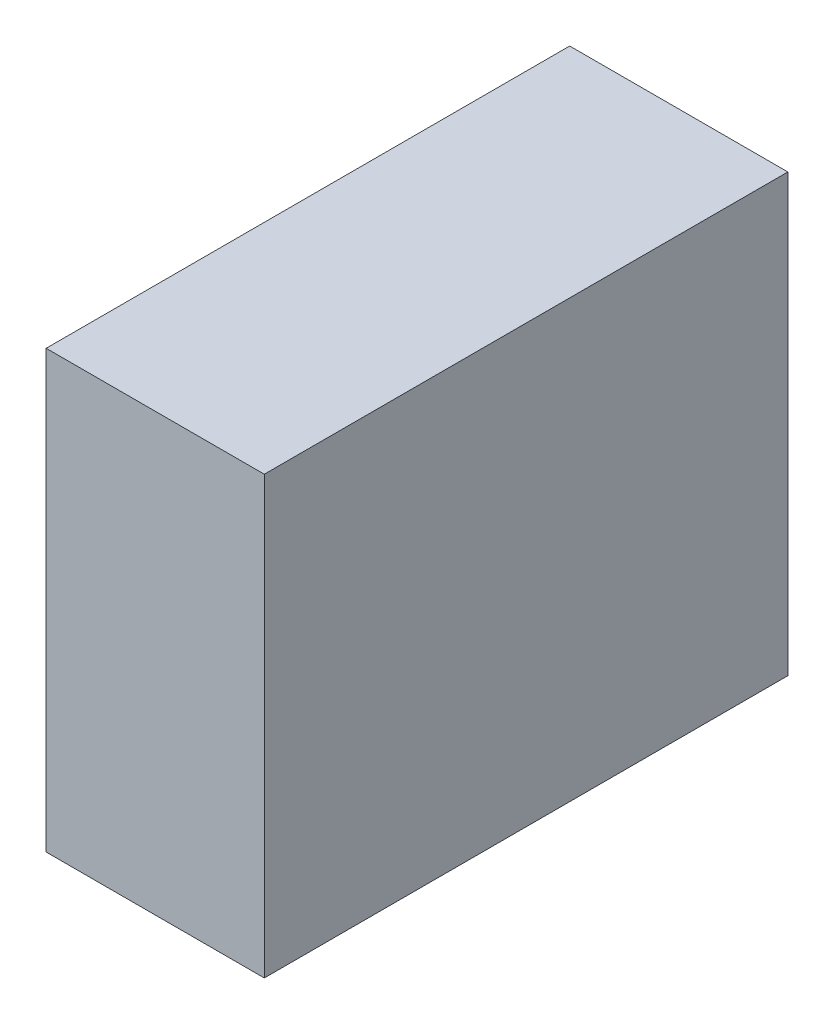
ISO-10303-21;
HEADER;
FILE_DESCRIPTION(('STEP AP214'),'2;1');
FILE_NAME('part.step','',(''),(''),'','','');
FILE_SCHEMA(('AUTOMOTIVE_DESIGN { 1 0 10303 214 1 1 1 1 }'));
ENDSEC;
DATA;
#1=APPLICATION_CONTEXT('core data for automotive mechanical design processes');
#2=APPLICATION_PROTOCOL_DEFINITION('international standard','automotive_design',2000,#1);
#3=PRODUCT_CONTEXT('',#1,'mechanical');
#4=PRODUCT('Part','Part','',(#3));
#5=PRODUCT_RELATED_PRODUCT_CATEGORY('part','',(#4));
#6=PRODUCT_DEFINITION_FORMATION('','',#4);
#7=PRODUCT_DEFINITION_CONTEXT('part definition',#1,'design');
#8=PRODUCT_DEFINITION('design','',#6,#7);
#9=PRODUCT_DEFINITION_SHAPE('','',#8);
#10=(LENGTH_UNIT() NAMED_UNIT(*) SI_UNIT(.MILLI.,.METRE.));
#11=(NAMED_UNIT(*) PLANE_ANGLE_UNIT() SI_UNIT($,.RADIAN.));
#12=(NAMED_UNIT(*) SI_UNIT($,.STERADIAN.) SOLID_ANGLE_UNIT());
#13=UNCERTAINTY_MEASURE_WITH_UNIT(LENGTH_MEASURE(1.E-05),#10,'distance_accuracy_value','');
#14=(GEOMETRIC_REPRESENTATION_CONTEXT(3) GLOBAL_UNCERTAINTY_ASSIGNED_CONTEXT((#13)) GLOBAL_UNIT_ASSIGNED_CONTEXT((#10,
#11,#12)) REPRESENTATION_CONTEXT('',''));
#15=CARTESIAN_POINT('',(0.,0.,0.));
#16=DIRECTION('',(0.,0.,1.));
#17=DIRECTION('',(1.,0.,0.));
#18=AXIS2_PLACEMENT_3D('',#15,#16,#17);
#19=CARTESIAN_POINT('',(440.,200.,-248.));
#20=DIRECTION('',(-1.,0.,0.));
#21=DIRECTION('',(0.,0.,1.));
#22=AXIS2_PLACEMENT_3D('',#19,#20,#21);
#23=PLANE('',#22);
#24=DIRECTION('',(0.,-1.,0.));
#25=VECTOR('',#24,1.);
#26=CARTESIAN_POINT('',(440.,200.,-128.));
#27=LINE('',#26,#25);
#28=CARTESIAN_POINT('',(440.,300.,-128.));
#29=VERTEX_POINT('',#28);
#30=CARTESIAN_POINT('',(440.,200.,-128.));
#31=VERTEX_POINT('',#30);
#32=EDGE_CURVE('E103',#29,#31,#27,.T.);
#33=ORIENTED_EDGE('',*,*,#32,.F.);
#34=DIRECTION('',(0.,0.,1.));
#35=VECTOR('',#34,1.);
#36=CARTESIAN_POINT('',(440.,300.,-248.));
#37=LINE('',#36,#35);
#38=CARTESIAN_POINT('',(440.,300.,-248.));
#39=VERTEX_POINT('',#38);
#40=EDGE_CURVE('E11',#39,#29,#37,.T.);
#41=ORIENTED_EDGE('',*,*,#40,.F.);
#42=DIRECTION('',(0.,-1.,0.));
#43=VECTOR('',#42,1.);
#44=CARTESIAN_POINT('',(440.,200.,-248.));
#45=LINE('',#44,#43);
#46=CARTESIAN_POINT('',(440.,200.,-248.));
#47=VERTEX_POINT('',#46);
#48=EDGE_CURVE('E97',#39,#47,#45,.T.);
#49=ORIENTED_EDGE('',*,*,#48,.T.);
#50=DIRECTION('',(0.,0.,1.));
#51=VECTOR('',#50,1.);
#52=CARTESIAN_POINT('',(440.,200.,-248.));
#53=LINE('',#52,#51);
#54=EDGE_CURVE('E42',#47,#31,#53,.T.);
#55=ORIENTED_EDGE('',*,*,#54,.T.);
#56=EDGE_LOOP('',(#33,#41,#49,#55));
#57=FACE_BOUND('',#56,.T.);
#58=ADVANCED_FACE('F39',(#57),#23,.T.);
#59=CARTESIAN_POINT('',(440.,300.,-248.));
#60=DIRECTION('',(0.,1.,0.));
#61=DIRECTION('',(0.,0.,1.));
#62=AXIS2_PLACEMENT_3D('',#59,#60,#61);
#63=PLANE('',#62);
#64=DIRECTION('',(-1.,0.,0.));
#65=VECTOR('',#64,1.);
#66=CARTESIAN_POINT('',(440.,300.,-128.));
#67=LINE('',#66,#65);
#68=CARTESIAN_POINT('',(490.,300.,-128.));
#69=VERTEX_POINT('',#68);
#70=EDGE_CURVE('E99',#69,#29,#67,.T.);
#71=ORIENTED_EDGE('',*,*,#70,.F.);
#72=DIRECTION('',(0.,0.,1.));
#73=VECTOR('',#72,1.);
#74=CARTESIAN_POINT('',(490.,300.,-248.));
#75=LINE('',#74,#73);
#76=CARTESIAN_POINT('',(490.,300.,-248.));
#77=VERTEX_POINT('',#76);
#78=EDGE_CURVE('E48',#77,#69,#75,.T.);
#79=ORIENTED_EDGE('',*,*,#78,.F.);
#80=DIRECTION('',(-1.,0.,0.));
#81=VECTOR('',#80,1.);
#82=CARTESIAN_POINT('',(440.,300.,-248.));
#83=LINE('',#82,#81);
#84=EDGE_CURVE('E94',#77,#39,#83,.T.);
#85=ORIENTED_EDGE('',*,*,#84,.T.);
#86=ORIENTED_EDGE('',*,*,#40,.T.);
#87=EDGE_LOOP('',(#71,#79,#85,#86));
#88=FACE_BOUND('',#87,.T.);
#89=ADVANCED_FACE('F113',(#88),#63,.T.);
#90=CARTESIAN_POINT('',(490.,200.,-248.));
#91=DIRECTION('',(1.,0.,0.));
#92=DIRECTION('',(0.,0.,-1.));
#93=AXIS2_PLACEMENT_3D('',#90,#91,#92);
#94=PLANE('',#93);
#95=DIRECTION('',(0.,1.,0.));
#96=VECTOR('',#95,1.);
#97=CARTESIAN_POINT('',(490.,200.,-128.));
#98=LINE('',#97,#96);
#99=CARTESIAN_POINT('',(490.,200.,-128.));
#100=VERTEX_POINT('',#99);
#101=EDGE_CURVE('E89',#100,#69,#98,.T.);
#102=ORIENTED_EDGE('',*,*,#101,.F.);
#103=DIRECTION('',(0.,0.,1.));
#104=VECTOR('',#103,1.);
#105=CARTESIAN_POINT('',(490.,200.,-248.));
#106=LINE('',#105,#104);
#107=CARTESIAN_POINT('',(490.,200.,-248.));
#108=VERTEX_POINT('',#107);
#109=EDGE_CURVE('E84',#108,#100,#106,.T.);
#110=ORIENTED_EDGE('',*,*,#109,.F.);
#111=DIRECTION('',(0.,1.,0.));
#112=VECTOR('',#111,1.);
#113=CARTESIAN_POINT('',(490.,200.,-248.));
#114=LINE('',#113,#112);
#115=EDGE_CURVE('E87',#108,#77,#114,.T.);
#116=ORIENTED_EDGE('',*,*,#115,.T.);
#117=ORIENTED_EDGE('',*,*,#78,.T.);
#118=EDGE_LOOP('',(#102,#110,#116,#117));
#119=FACE_BOUND('',#118,.T.);
#120=ADVANCED_FACE('F86',(#119),#94,.T.);
#121=CARTESIAN_POINT('',(440.,200.,-248.));
#122=DIRECTION('',(0.,-1.,0.));
#123=DIRECTION('',(0.,0.,-1.));
#124=AXIS2_PLACEMENT_3D('',#121,#122,#123);
#125=PLANE('',#124);
#126=DIRECTION('',(1.,0.,0.));
#127=VECTOR('',#126,1.);
#128=CARTESIAN_POINT('',(440.,200.,-128.));
#129=LINE('',#128,#127);
#130=EDGE_CURVE('E106',#31,#100,#129,.T.);
#131=ORIENTED_EDGE('',*,*,#130,.F.);
#132=ORIENTED_EDGE('',*,*,#54,.F.);
#133=DIRECTION('',(1.,0.,0.));
#134=VECTOR('',#133,1.);
#135=CARTESIAN_POINT('',(440.,200.,-248.));
#136=LINE('',#135,#134);
#137=EDGE_CURVE('E93',#47,#108,#136,.T.);
#138=ORIENTED_EDGE('',*,*,#137,.T.);
#139=ORIENTED_EDGE('',*,*,#109,.T.);
#140=EDGE_LOOP('',(#131,#132,#138,#139));
#141=FACE_BOUND('',#140,.T.);
#142=ADVANCED_FACE('F96',(#141),#125,.T.);
#143=CARTESIAN_POINT('',(0.,0.,-248.));
#144=DIRECTION('',(0.,0.,-1.));
#145=DIRECTION('',(-1.,0.,0.));
#146=AXIS2_PLACEMENT_3D('',#143,#144,#145);
#147=PLANE('',#146);
#148=ORIENTED_EDGE('',*,*,#48,.F.);
#149=ORIENTED_EDGE('',*,*,#84,.F.);
#150=ORIENTED_EDGE('',*,*,#115,.F.);
#151=ORIENTED_EDGE('',*,*,#137,.F.);
#152=EDGE_LOOP('',(#148,#149,#150,#151));
#153=FACE_BOUND('',#152,.T.);
#154=ADVANCED_FACE('F92',(#153),#147,.T.);
#155=CARTESIAN_POINT('',(0.,0.,-128.));
#156=DIRECTION('',(0.,0.,-1.));
#157=DIRECTION('',(-1.,0.,0.));
#158=AXIS2_PLACEMENT_3D('',#155,#156,#157);
#159=PLANE('',#158);
#160=ORIENTED_EDGE('',*,*,#32,.T.);
#161=ORIENTED_EDGE('',*,*,#130,.T.);
#162=ORIENTED_EDGE('',*,*,#101,.T.);
#163=ORIENTED_EDGE('',*,*,#70,.T.);
#164=EDGE_LOOP('',(#160,#161,#162,#163));
#165=FACE_BOUND('',#164,.T.);
#166=ADVANCED_FACE('F112',(#165),#159,.F.);
#167=CLOSED_SHELL('',(#58,#89,#120,#142,#154,#166));
#168=MANIFOLD_SOLID_BREP('B2',#167);
#169=ADVANCED_BREP_SHAPE_REPRESENTATION('',(#18,#168),#14);
#170=SHAPE_DEFINITION_REPRESENTATION(#9,#169);
ENDSEC;
END-ISO-10303-21;
